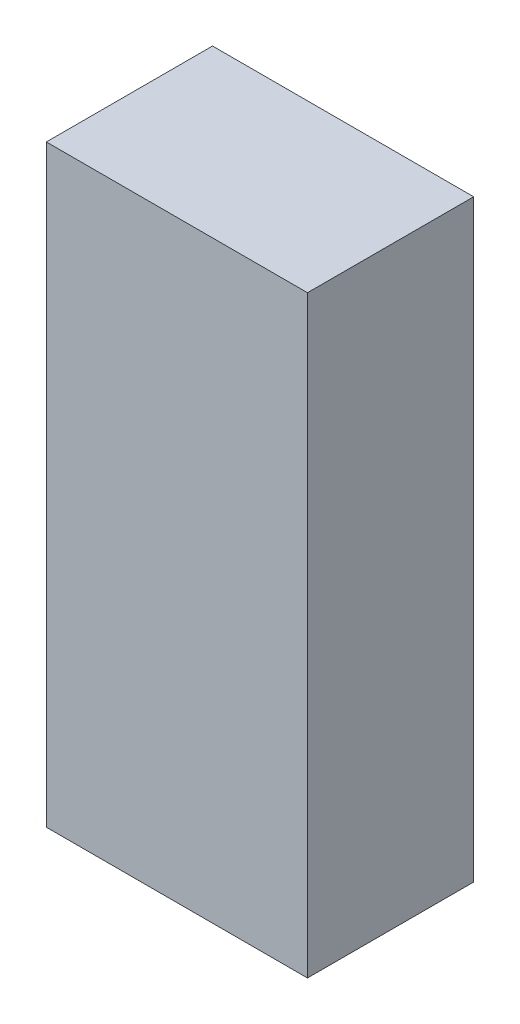
ISO-10303-21;
HEADER;
FILE_DESCRIPTION(('STEP AP214'),'2;1');
FILE_NAME('part.step','',(''),(''),'','','');
FILE_SCHEMA(('AUTOMOTIVE_DESIGN { 1 0 10303 214 1 1 1 1 }'));
ENDSEC;
DATA;
#1=APPLICATION_CONTEXT('core data for automotive mechanical design processes');
#2=APPLICATION_PROTOCOL_DEFINITION('international standard','automotive_design',2000,#1);
#3=PRODUCT_CONTEXT('',#1,'mechanical');
#4=PRODUCT('Part','Part','',(#3));
#5=PRODUCT_RELATED_PRODUCT_CATEGORY('part','',(#4));
#6=PRODUCT_DEFINITION_FORMATION('','',#4);
#7=PRODUCT_DEFINITION_CONTEXT('part definition',#1,'design');
#8=PRODUCT_DEFINITION('design','',#6,#7);
#9=PRODUCT_DEFINITION_SHAPE('','',#8);
#10=(LENGTH_UNIT() NAMED_UNIT(*) SI_UNIT(.MILLI.,.METRE.));
#11=(NAMED_UNIT(*) PLANE_ANGLE_UNIT() SI_UNIT($,.RADIAN.));
#12=(NAMED_UNIT(*) SI_UNIT($,.STERADIAN.) SOLID_ANGLE_UNIT());
#13=UNCERTAINTY_MEASURE_WITH_UNIT(LENGTH_MEASURE(1.E-05),#10,'distance_accuracy_value','');
#14=(GEOMETRIC_REPRESENTATION_CONTEXT(3) GLOBAL_UNCERTAINTY_ASSIGNED_CONTEXT((#13)) GLOBAL_UNIT_ASSIGNED_CONTEXT((#10,
#11,#12)) REPRESENTATION_CONTEXT('',''));
#15=CARTESIAN_POINT('',(0.,0.,0.));
#16=DIRECTION('',(0.,0.,1.));
#17=DIRECTION('',(1.,0.,0.));
#18=AXIS2_PLACEMENT_3D('',#15,#16,#17);
#19=CARTESIAN_POINT('',(-74.5,-124.,192.5));
#20=DIRECTION('',(0.,0.,1.));
#21=DIRECTION('',(1.,0.,0.));
#22=AXIS2_PLACEMENT_3D('',#19,#20,#21);
#23=PLANE('',#22);
#24=DIRECTION('',(-1.,0.,0.));
#25=VECTOR('',#24,1.);
#26=CARTESIAN_POINT('',(-74.5,-124.,192.5));
#27=LINE('',#26,#25);
#28=CARTESIAN_POINT('',(-74.5,-124.,192.5));
#29=VERTEX_POINT('',#28);
#30=CARTESIAN_POINT('',(-85.5,-124.,192.5));
#31=VERTEX_POINT('',#30);
#32=EDGE_CURVE('E103',#29,#31,#27,.T.);
#33=ORIENTED_EDGE('',*,*,#32,.F.);
#34=DIRECTION('',(0.,1.,0.));
#35=VECTOR('',#34,1.);
#36=CARTESIAN_POINT('',(-74.5,-124.,192.5));
#37=LINE('',#36,#35);
#38=CARTESIAN_POINT('',(-74.5,-99.,192.5));
#39=VERTEX_POINT('',#38);
#40=EDGE_CURVE('E66',#29,#39,#37,.T.);
#41=ORIENTED_EDGE('',*,*,#40,.T.);
#42=DIRECTION('',(-1.,0.,0.));
#43=VECTOR('',#42,1.);
#44=CARTESIAN_POINT('',(-74.5,-99.,192.5));
#45=LINE('',#44,#43);
#46=CARTESIAN_POINT('',(-85.5,-99.,192.5));
#47=VERTEX_POINT('',#46);
#48=EDGE_CURVE('E92',#39,#47,#45,.T.);
#49=ORIENTED_EDGE('',*,*,#48,.T.);
#50=DIRECTION('',(0.,1.,0.));
#51=VECTOR('',#50,1.);
#52=CARTESIAN_POINT('',(-85.5,-124.,192.5));
#53=LINE('',#52,#51);
#54=EDGE_CURVE('E9',#31,#47,#53,.T.);
#55=ORIENTED_EDGE('',*,*,#54,.F.);
#56=EDGE_LOOP('',(#33,#41,#49,#55));
#57=FACE_BOUND('',#56,.T.);
#58=ADVANCED_FACE('F14',(#57),#23,.T.);
#59=CARTESIAN_POINT('',(-74.5,-124.,185.5));
#60=DIRECTION('',(0.,0.,1.));
#61=DIRECTION('',(1.,0.,0.));
#62=AXIS2_PLACEMENT_3D('',#59,#60,#61);
#63=PLANE('',#62);
#64=DIRECTION('',(0.,1.,0.));
#65=VECTOR('',#64,1.);
#66=CARTESIAN_POINT('',(-85.5,-124.,185.5));
#67=LINE('',#66,#65);
#68=CARTESIAN_POINT('',(-85.5,-124.,185.5));
#69=VERTEX_POINT('',#68);
#70=CARTESIAN_POINT('',(-85.5,-99.,185.5));
#71=VERTEX_POINT('',#70);
#72=EDGE_CURVE('E25',#69,#71,#67,.T.);
#73=ORIENTED_EDGE('',*,*,#72,.T.);
#74=DIRECTION('',(-1.,0.,0.));
#75=VECTOR('',#74,1.);
#76=CARTESIAN_POINT('',(-74.5,-99.,185.5));
#77=LINE('',#76,#75);
#78=CARTESIAN_POINT('',(-74.5,-99.,185.5));
#79=VERTEX_POINT('',#78);
#80=EDGE_CURVE('E84',#79,#71,#77,.T.);
#81=ORIENTED_EDGE('',*,*,#80,.F.);
#82=DIRECTION('',(0.,1.,0.));
#83=VECTOR('',#82,1.);
#84=CARTESIAN_POINT('',(-74.5,-124.,185.5));
#85=LINE('',#84,#83);
#86=CARTESIAN_POINT('',(-74.5,-124.,185.5));
#87=VERTEX_POINT('',#86);
#88=EDGE_CURVE('E73',#87,#79,#85,.T.);
#89=ORIENTED_EDGE('',*,*,#88,.F.);
#90=DIRECTION('',(-1.,0.,0.));
#91=VECTOR('',#90,1.);
#92=CARTESIAN_POINT('',(-74.5,-124.,185.5));
#93=LINE('',#92,#91);
#94=EDGE_CURVE('E99',#87,#69,#93,.T.);
#95=ORIENTED_EDGE('',*,*,#94,.T.);
#96=EDGE_LOOP('',(#73,#81,#89,#95));
#97=FACE_BOUND('',#96,.T.);
#98=ADVANCED_FACE('F85',(#97),#63,.F.);
#99=CARTESIAN_POINT('',(-85.5,-124.,185.5));
#100=DIRECTION('',(-1.,0.,0.));
#101=DIRECTION('',(0.,0.,1.));
#102=AXIS2_PLACEMENT_3D('',#99,#100,#101);
#103=PLANE('',#102);
#104=ORIENTED_EDGE('',*,*,#72,.F.);
#105=DIRECTION('',(0.,0.,1.));
#106=VECTOR('',#105,1.);
#107=CARTESIAN_POINT('',(-85.5,-124.,185.5));
#108=LINE('',#107,#106);
#109=EDGE_CURVE('E18',#69,#31,#108,.T.);
#110=ORIENTED_EDGE('',*,*,#109,.T.);
#111=ORIENTED_EDGE('',*,*,#54,.T.);
#112=DIRECTION('',(0.,0.,1.));
#113=VECTOR('',#112,1.);
#114=CARTESIAN_POINT('',(-85.5,-99.,185.5));
#115=LINE('',#114,#113);
#116=EDGE_CURVE('E89',#71,#47,#115,.T.);
#117=ORIENTED_EDGE('',*,*,#116,.F.);
#118=EDGE_LOOP('',(#104,#110,#111,#117));
#119=FACE_BOUND('',#118,.T.);
#120=ADVANCED_FACE('F114',(#119),#103,.T.);
#121=CARTESIAN_POINT('',(-74.5,-124.,185.5));
#122=DIRECTION('',(-1.,0.,0.));
#123=DIRECTION('',(0.,0.,1.));
#124=AXIS2_PLACEMENT_3D('',#121,#122,#123);
#125=PLANE('',#124);
#126=DIRECTION('',(0.,0.,1.));
#127=VECTOR('',#126,1.);
#128=CARTESIAN_POINT('',(-74.5,-99.,185.5));
#129=LINE('',#128,#127);
#130=EDGE_CURVE('E76',#79,#39,#129,.T.);
#131=ORIENTED_EDGE('',*,*,#130,.T.);
#132=ORIENTED_EDGE('',*,*,#40,.F.);
#133=DIRECTION('',(0.,0.,1.));
#134=VECTOR('',#133,1.);
#135=CARTESIAN_POINT('',(-74.5,-124.,185.5));
#136=LINE('',#135,#134);
#137=EDGE_CURVE('E78',#87,#29,#136,.T.);
#138=ORIENTED_EDGE('',*,*,#137,.F.);
#139=ORIENTED_EDGE('',*,*,#88,.T.);
#140=EDGE_LOOP('',(#131,#132,#138,#139));
#141=FACE_BOUND('',#140,.T.);
#142=ADVANCED_FACE('F16',(#141),#125,.F.);
#143=CARTESIAN_POINT('',(-74.5,-99.,185.5));
#144=DIRECTION('',(0.,1.,0.));
#145=DIRECTION('',(1.,0.,0.));
#146=AXIS2_PLACEMENT_3D('',#143,#144,#145);
#147=PLANE('',#146);
#148=ORIENTED_EDGE('',*,*,#130,.F.);
#149=ORIENTED_EDGE('',*,*,#80,.T.);
#150=ORIENTED_EDGE('',*,*,#116,.T.);
#151=ORIENTED_EDGE('',*,*,#48,.F.);
#152=EDGE_LOOP('',(#148,#149,#150,#151));
#153=FACE_BOUND('',#152,.T.);
#154=ADVANCED_FACE('F91',(#153),#147,.T.);
#155=CARTESIAN_POINT('',(-74.5,-124.,185.5));
#156=DIRECTION('',(0.,1.,0.));
#157=DIRECTION('',(1.,0.,0.));
#158=AXIS2_PLACEMENT_3D('',#155,#156,#157);
#159=PLANE('',#158);
#160=ORIENTED_EDGE('',*,*,#32,.T.);
#161=ORIENTED_EDGE('',*,*,#109,.F.);
#162=ORIENTED_EDGE('',*,*,#94,.F.);
#163=ORIENTED_EDGE('',*,*,#137,.T.);
#164=EDGE_LOOP('',(#160,#161,#162,#163));
#165=FACE_BOUND('',#164,.T.);
#166=ADVANCED_FACE('F128',(#165),#159,.F.);
#167=CLOSED_SHELL('',(#58,#98,#120,#142,#154,#166));
#168=MANIFOLD_SOLID_BREP('B1',#167);
#169=ADVANCED_BREP_SHAPE_REPRESENTATION('',(#18,#168),#14);
#170=SHAPE_DEFINITION_REPRESENTATION(#9,#169);
ENDSEC;
END-ISO-10303-21;
